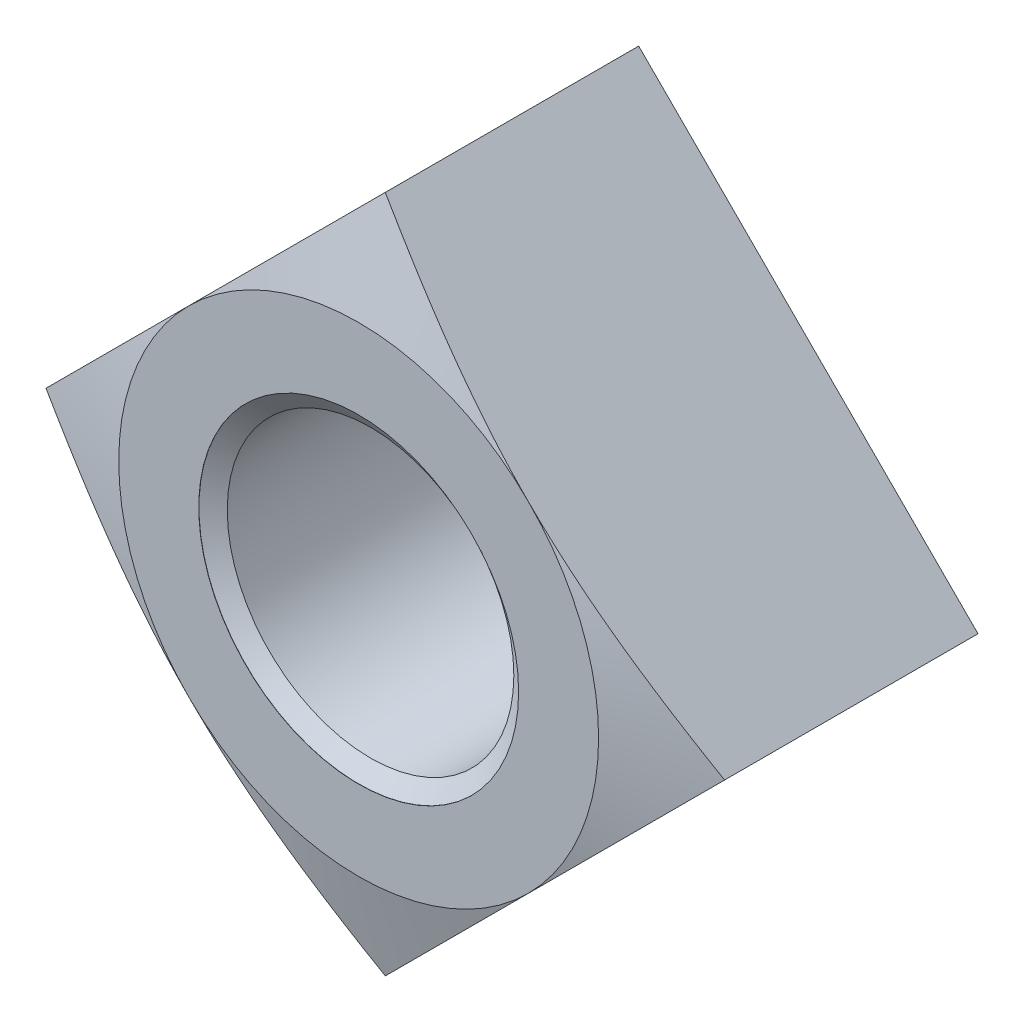
ISO-10303-21;
HEADER;
FILE_DESCRIPTION(('STEP AP214'),'2;1');
FILE_NAME('part.step','',(''),(''),'','','');
FILE_SCHEMA(('AUTOMOTIVE_DESIGN { 1 0 10303 214 1 1 1 1 }'));
ENDSEC;
DATA;
#1=APPLICATION_CONTEXT('core data for automotive mechanical design processes');
#2=APPLICATION_PROTOCOL_DEFINITION('international standard','automotive_design',2000,#1);
#3=PRODUCT_CONTEXT('',#1,'mechanical');
#4=PRODUCT('Part','Part','',(#3));
#5=PRODUCT_RELATED_PRODUCT_CATEGORY('part','',(#4));
#6=PRODUCT_DEFINITION_FORMATION('','',#4);
#7=PRODUCT_DEFINITION_CONTEXT('part definition',#1,'design');
#8=PRODUCT_DEFINITION('design','',#6,#7);
#9=PRODUCT_DEFINITION_SHAPE('','',#8);
#10=(LENGTH_UNIT() NAMED_UNIT(*) SI_UNIT(.MILLI.,.METRE.));
#11=(NAMED_UNIT(*) PLANE_ANGLE_UNIT() SI_UNIT($,.RADIAN.));
#12=(NAMED_UNIT(*) SI_UNIT($,.STERADIAN.) SOLID_ANGLE_UNIT());
#13=UNCERTAINTY_MEASURE_WITH_UNIT(LENGTH_MEASURE(1.E-05),#10,'distance_accuracy_value','');
#14=(GEOMETRIC_REPRESENTATION_CONTEXT(3) GLOBAL_UNCERTAINTY_ASSIGNED_CONTEXT((#13)) GLOBAL_UNIT_ASSIGNED_CONTEXT((#10,
#11,#12)) REPRESENTATION_CONTEXT('',''));
#15=CARTESIAN_POINT('',(0.,0.,0.));
#16=DIRECTION('',(0.,0.,1.));
#17=DIRECTION('',(1.,0.,0.));
#18=AXIS2_PLACEMENT_3D('',#15,#16,#17);
#19=CARTESIAN_POINT('',(40.4111525448112,0.,0.));
#20=DIRECTION('',(0.,0.,1.));
#21=DIRECTION('',(1.,0.,0.));
#22=AXIS2_PLACEMENT_3D('',#19,#20,#21);
#23=PLANE('',#22);
#24=CARTESIAN_POINT('',(0.,0.,0.));
#25=DIRECTION('',(0.,0.,1.));
#26=DIRECTION('',(1.,0.,0.));
#27=AXIS2_PLACEMENT_3D('',#24,#25,#26);
#28=CIRCLE('',#27,19.05);
#29=CARTESIAN_POINT('',(19.05,0.,0.));
#30=VERTEX_POINT('',#29);
#31=EDGE_CURVE('E208',#30,#30,#28,.T.);
#32=ORIENTED_EDGE('',*,*,#31,.F.);
#33=EDGE_LOOP('',(#32));
#34=FACE_BOUND('',#33,.T.);
#35=CARTESIAN_POINT('',(0.,0.,0.));
#36=DIRECTION('',(0.,0.,1.));
#37=DIRECTION('',(1.,0.,0.));
#38=AXIS2_PLACEMENT_3D('',#35,#36,#37);
#39=CIRCLE('',#38,28.575);
#40=CARTESIAN_POINT('',(20.2055762724056,-20.2055762724056,0.));
#41=VERTEX_POINT('',#40);
#42=CARTESIAN_POINT('',(20.2055762724056,20.2055762724056,0.));
#43=VERTEX_POINT('',#42);
#44=EDGE_CURVE('E53',#41,#43,#39,.T.);
#45=ORIENTED_EDGE('',*,*,#44,.T.);
#46=CARTESIAN_POINT('',(-20.2055762724056,20.2055762724056,0.));
#47=VERTEX_POINT('',#46);
#48=EDGE_CURVE('E101',#43,#47,#39,.T.);
#49=ORIENTED_EDGE('',*,*,#48,.T.);
#50=CARTESIAN_POINT('',(-20.2055762724056,-20.2055762724056,0.));
#51=VERTEX_POINT('',#50);
#52=EDGE_CURVE('E90',#47,#51,#39,.T.);
#53=ORIENTED_EDGE('',*,*,#52,.T.);
#54=EDGE_CURVE('E102',#51,#41,#39,.T.);
#55=ORIENTED_EDGE('',*,*,#54,.T.);
#56=EDGE_LOOP('',(#45,#49,#53,#55));
#57=FACE_BOUND('',#56,.T.);
#58=ADVANCED_FACE('F32',(#34,#57),#23,.T.);
#59=CARTESIAN_POINT('',(0.,-40.4111525448112,-33.3502));
#60=DIRECTION('',(0.707106781186548,-0.707106781186547,0.));
#61=DIRECTION('',(0.707106781186547,0.707106781186548,0.));
#62=AXIS2_PLACEMENT_3D('',#59,#60,#61);
#63=PLANE('',#62);
#64=DIRECTION('',(0.,0.,1.));
#65=VECTOR('',#64,1.);
#66=CARTESIAN_POINT('',(40.4111525448112,0.,-33.3502));
#67=LINE('',#66,#65);
#68=CARTESIAN_POINT('',(40.4111525448112,0.,-33.3502));
#69=VERTEX_POINT('',#68);
#70=CARTESIAN_POINT('',(40.4111525448112,0.,-3.17148751587369));
#71=VERTEX_POINT('',#70);
#72=EDGE_CURVE('E127',#69,#71,#67,.T.);
#73=ORIENTED_EDGE('',*,*,#72,.T.);
#74=CARTESIAN_POINT('',(40.4113525448112,0.000199999999990139,-3.17154110584479));
#75=CARTESIAN_POINT('',(39.8049108327059,-0.606241712105331,-3.00907310921222));
#76=CARTESIAN_POINT('',(39.1979948923913,-1.21315765241987,-2.85008038156504));
#77=CARTESIAN_POINT('',(37.9830969400787,-2.42805560473245,-2.54023632423008));
#78=CARTESIAN_POINT('',(37.3751148796716,-3.03603766513954,-2.38938537466495));
#79=CARTESIAN_POINT('',(36.1576234546933,-4.25352909011794,-2.09693498869072));
#80=CARTESIAN_POINT('',(35.5481133486823,-4.86303919612893,-1.95534170129563));
#81=CARTESIAN_POINT('',(34.3278938374312,-6.08325870738002,-1.68292515738994));
#82=CARTESIAN_POINT('',(33.7171844457876,-6.69396809902361,-1.55210177949253));
#83=CARTESIAN_POINT('',(32.4938208685179,-7.91733167629333,-1.302638577703));
#84=CARTESIAN_POINT('',(31.8811652725894,-8.52998727222175,-1.18401252483834));
#85=CARTESIAN_POINT('',(30.6545606640344,-9.75659188077683,-0.960801437423963));
#86=CARTESIAN_POINT('',(30.0406116323939,-10.3705409124173,-0.856216610766811));
#87=CARTESIAN_POINT('',(28.8115781352393,-11.5995744095719,-0.662871488970059));
#88=CARTESIAN_POINT('',(28.1964939044618,-12.2146586403494,-0.574108227416928));
#89=CARTESIAN_POINT('',(26.9651979897377,-13.4459545550735,-0.414126002999316));
#90=CARTESIAN_POINT('',(26.348986343602,-14.0621662012092,-0.342906462245195));
#91=CARTESIAN_POINT('',(25.1249196303647,-15.2862329144465,-0.220530435060478));
#92=CARTESIAN_POINT('',(24.517079007112,-15.8940735376992,-0.169087015718146));
#93=CARTESIAN_POINT('',(23.3007173298575,-17.1104352149537,-0.0859933301985728));
#94=CARTESIAN_POINT('',(22.6921962773717,-17.7189562674395,-0.0543430200092361));
#95=CARTESIAN_POINT('',(21.4747809915278,-18.9363715532834,-0.0116521308581042));
#96=CARTESIAN_POINT('',(20.8658867529548,-19.5452657918564,-0.0006118467922335));
#97=CARTESIAN_POINT('',(19.6480888418748,-20.7630637029364,0.000562277070735697));
#98=CARTESIAN_POINT('',(19.0391851693806,-21.3719673754306,-0.00930385698045055));
#99=CARTESIAN_POINT('',(17.8223388137589,-22.5888137310523,-0.0496574013299574));
#100=CARTESIAN_POINT('',(17.2143957815506,-23.1967567632606,-0.0801239453329884));
#101=CARTESIAN_POINT('',(15.9991691630363,-24.4119833817749,-0.160870006458026));
#102=CARTESIAN_POINT('',(15.3918855812378,-25.0192669635734,-0.21114965816265));
#103=CARTESIAN_POINT('',(14.1782458384852,-26.2329067063261,-0.330309402665974));
#104=CARTESIAN_POINT('',(13.5718896669453,-26.8392628778659,-0.399189281541856));
#105=CARTESIAN_POINT('',(12.3602697900355,-28.0508827547757,-0.554049736934115));
#106=CARTESIAN_POINT('',(11.7550060965402,-28.656146448271,-0.640030498214002));
#107=CARTESIAN_POINT('',(10.684359968988,-29.7267925758232,-0.805948996182882));
#108=CARTESIAN_POINT('',(10.2187321373252,-30.192420407486,-0.882750320419414));
#109=CARTESIAN_POINT('',(9.28824541880411,-31.1229071260071,-1.04475379647959));
#110=CARTESIAN_POINT('',(8.8233864781428,-31.5877660666684,-1.12995533281697));
#111=CARTESIAN_POINT('',(7.42979162874999,-32.9813609160612,-1.39704514025262));
#112=CARTESIAN_POINT('',(6.50214667641665,-33.9090058683946,-1.59040136314882));
#113=CARTESIAN_POINT('',(5.10983637465686,-35.3013161701544,-1.89982246144864));
#114=CARTESIAN_POINT('',(4.64411244355319,-35.767040101258,-2.00656403039739));
#115=CARTESIAN_POINT('',(3.71333417916436,-36.6978183656469,-2.22574783196878));
#116=CARTESIAN_POINT('',(3.24827984460547,-37.1628727002058,-2.33819005373277));
#117=CARTESIAN_POINT('',(2.31897604167655,-38.0921765031347,-2.56814637951577));
#118=CARTESIAN_POINT('',(1.85472634125612,-38.5564262035551,-2.68565861475695));
#119=CARTESIAN_POINT('',(0.926825758606277,-39.484326786205,-2.92527992716862));
#120=CARTESIAN_POINT('',(0.463174869317014,-39.9479776754942,-3.04738894962273));
#121=CARTESIAN_POINT('',(-0.000199999999975971,-40.4113525448112,-3.1715411058448));
#122=B_SPLINE_CURVE_WITH_KNOTS('',3,(#74,#75,#76,#77,#78,#79,#80,#81,#82,#83,#84,#85,#86,#87,
#88,#89,#90,#91,#92,#93,#94,#95,#96,#97,#98,#99,#100,#101,#102,#103,#104,#105,#106,#107,#108,
#109,#110,#111,#112,#113,#114,#115,#116,#117,#118,#119,#120,#121),.UNSPECIFIED.,.F.,.F.,(4,2,2,
2,2,2,2,2,2,2,2,2,2,2,2,2,2,2,2,2,2,2,2,4),(0.,2.61868429864241,5.23749075262517,
7.85801932966209,10.4785183668779,13.1019442433153,15.7254089575724,18.348381275154,
20.9712671805487,23.5545153572028,26.1377577897078,28.7210371839236,31.3043133467324,
33.8849768035376,36.4656577900728,39.0463090972375,41.6269882881152,43.6158142238468,
45.6044945457988,49.5823203342872,51.5839847153093,53.5856452836867,55.5865742514621,
57.5874794093466),.UNSPECIFIED.);
#123=EDGE_CURVE('E123',#71,#41,#122,.T.);
#124=ORIENTED_EDGE('',*,*,#123,.T.);
#125=CARTESIAN_POINT('',(0.,-40.4111525448112,-3.1714875158737));
#126=VERTEX_POINT('',#125);
#127=EDGE_CURVE('E119',#41,#126,#122,.T.);
#128=ORIENTED_EDGE('',*,*,#127,.T.);
#129=DIRECTION('',(0.,0.,1.));
#130=VECTOR('',#129,1.);
#131=CARTESIAN_POINT('',(0.,-40.4111525448112,-33.3502));
#132=LINE('',#131,#130);
#133=CARTESIAN_POINT('',(0.,-40.4111525448112,-33.3502));
#134=VERTEX_POINT('',#133);
#135=EDGE_CURVE('E222',#134,#126,#132,.T.);
#136=ORIENTED_EDGE('',*,*,#135,.F.);
#137=DIRECTION('',(0.707106781186547,0.707106781186548,0.));
#138=VECTOR('',#137,1.);
#139=CARTESIAN_POINT('',(0.,-40.4111525448112,-33.3502));
#140=LINE('',#139,#138);
#141=EDGE_CURVE('E212',#134,#69,#140,.T.);
#142=ORIENTED_EDGE('',*,*,#141,.T.);
#143=EDGE_LOOP('',(#73,#124,#128,#136,#142));
#144=FACE_BOUND('',#143,.T.);
#145=ADVANCED_FACE('F34',(#144),#63,.T.);
#146=CARTESIAN_POINT('',(-40.4111525448112,0.,-33.3502));
#147=DIRECTION('',(-0.707106781186547,-0.707106781186547,0.));
#148=DIRECTION('',(0.707106781186548,-0.707106781186548,0.));
#149=AXIS2_PLACEMENT_3D('',#146,#147,#148);
#150=PLANE('',#149);
#151=ORIENTED_EDGE('',*,*,#135,.T.);
#152=CARTESIAN_POINT('',(0.000200000000022013,-40.4113525448112,-3.1715411058448));
#153=CARTESIAN_POINT('',(-0.606241712105305,-39.8049108327059,-3.00907310921222));
#154=CARTESIAN_POINT('',(-1.21315765241984,-39.1979948923913,-2.85008038156505));
#155=CARTESIAN_POINT('',(-2.42805560473243,-37.9830969400788,-2.54023632423009));
#156=CARTESIAN_POINT('',(-3.03603766513951,-37.3751148796717,-2.38938537466496));
#157=CARTESIAN_POINT('',(-4.25352909011791,-36.1576234546933,-2.09693498869073));
#158=CARTESIAN_POINT('',(-4.8630391961289,-35.5481133486823,-1.95534170129564));
#159=CARTESIAN_POINT('',(-6.08325870737999,-34.3278938374312,-1.68292515738995));
#160=CARTESIAN_POINT('',(-6.69396809902357,-33.7171844457876,-1.55210177949254));
#161=CARTESIAN_POINT('',(-7.9173316762933,-32.4938208685179,-1.30263857770301));
#162=CARTESIAN_POINT('',(-8.52998727222172,-31.8811652725895,-1.18401252483835));
#163=CARTESIAN_POINT('',(-9.7565918807768,-30.6545606640344,-0.960801437423967));
#164=CARTESIAN_POINT('',(-10.3705409124172,-30.040611632394,-0.856216610766815));
#165=CARTESIAN_POINT('',(-11.5995744095719,-28.8115781352393,-0.662871488970062));
#166=CARTESIAN_POINT('',(-12.2146586403494,-28.1964939044618,-0.574108227416929));
#167=CARTESIAN_POINT('',(-13.4459545550734,-26.9651979897378,-0.414126002999316));
#168=CARTESIAN_POINT('',(-14.0621662012091,-26.348986343602,-0.342906462245195));
#169=CARTESIAN_POINT('',(-15.2862329144465,-25.1249196303647,-0.220530435060478));
#170=CARTESIAN_POINT('',(-15.8940735376991,-24.5170790071121,-0.169087015718144));
#171=CARTESIAN_POINT('',(-17.1104352149536,-23.3007173298575,-0.0859933301985705));
#172=CARTESIAN_POINT('',(-17.7189562674395,-22.6921962773717,-0.0543430200092338));
#173=CARTESIAN_POINT('',(-18.9363715532834,-21.4747809915278,-0.0116521308581008));
#174=CARTESIAN_POINT('',(-19.5452657918564,-20.8658867529548,-0.000611846792229103));
#175=CARTESIAN_POINT('',(-20.7630637029364,-19.6480888418748,0.000562277070740596));
#176=CARTESIAN_POINT('',(-21.3719673754306,-19.0391851693806,-0.00930385698044618));
#177=CARTESIAN_POINT('',(-22.5888137310522,-17.8223388137589,-0.0496574013299524));
#178=CARTESIAN_POINT('',(-23.1967567632606,-17.2143957815506,-0.0801239453329823));
#179=CARTESIAN_POINT('',(-24.4119833817749,-15.9991691630363,-0.160870006458019));
#180=CARTESIAN_POINT('',(-25.0192669635734,-15.3918855812378,-0.211149658162644));
#181=CARTESIAN_POINT('',(-26.232906706326,-14.1782458384852,-0.330309402665967));
#182=CARTESIAN_POINT('',(-26.8392628778658,-13.5718896669453,-0.399189281541849));
#183=CARTESIAN_POINT('',(-28.0508827547757,-12.3602697900355,-0.554049736934107));
#184=CARTESIAN_POINT('',(-28.656146448271,-11.7550060965402,-0.640030498213993));
#185=CARTESIAN_POINT('',(-29.7267925758232,-10.684359968988,-0.805948996182873));
#186=CARTESIAN_POINT('',(-30.192420407486,-10.2187321373252,-0.882750320419406));
#187=CARTESIAN_POINT('',(-31.1229071260071,-9.28824541880411,-1.04475379647959));
#188=CARTESIAN_POINT('',(-31.5877660666684,-8.8233864781428,-1.12995533281696));
#189=CARTESIAN_POINT('',(-32.9813609160612,-7.42979162874998,-1.39704514025261));
#190=CARTESIAN_POINT('',(-33.9090058683946,-6.50214667641664,-1.59040136314882));
#191=CARTESIAN_POINT('',(-35.3013161701543,-5.10983637465685,-1.89982246144864));
#192=CARTESIAN_POINT('',(-35.767040101258,-4.64411244355318,-2.00656403039738));
#193=CARTESIAN_POINT('',(-36.6978183656468,-3.71333417916434,-2.22574783196877));
#194=CARTESIAN_POINT('',(-37.1628727002057,-3.24827984460546,-2.33819005373276));
#195=CARTESIAN_POINT('',(-38.0921765031347,-2.31897604167653,-2.56814637951576));
#196=CARTESIAN_POINT('',(-38.5564262035551,-1.8547263412561,-2.68565861475694));
#197=CARTESIAN_POINT('',(-39.4843267862049,-0.92682575860626,-2.92527992716862));
#198=CARTESIAN_POINT('',(-39.9479776754942,-0.463174869316998,-3.04738894962273));
#199=CARTESIAN_POINT('',(-40.4113525448112,0.000199999999993278,-3.17154110584479));
#200=B_SPLINE_CURVE_WITH_KNOTS('',3,(#152,#153,#154,#155,#156,#157,#158,#159,#160,#161,#162,
#163,#164,#165,#166,#167,#168,#169,#170,#171,#172,#173,#174,#175,#176,#177,#178,#179,#180,#181,
#182,#183,#184,#185,#186,#187,#188,#189,#190,#191,#192,#193,#194,#195,#196,#197,#198,#199),
.UNSPECIFIED.,.F.,.F.,(4,2,2,2,2,2,2,2,2,2,2,2,2,2,2,2,2,2,2,2,2,2,2,4),(0.,2.61868429864241,
5.23749075262516,7.85801932966209,10.4785183668779,13.1019442433153,15.7254089575724,
18.348381275154,20.9712671805487,23.5545153572028,26.1377577897078,28.7210371839237,
31.3043133467324,33.8849768035376,36.4656577900729,39.0463090972375,41.6269882881152,
43.6158142238468,45.6044945457989,49.5823203342872,51.5839847153094,53.5856452836868,
55.5865742514622,57.5874794093467),.UNSPECIFIED.);
#201=EDGE_CURVE('E117',#126,#51,#200,.T.);
#202=ORIENTED_EDGE('',*,*,#201,.T.);
#203=CARTESIAN_POINT('',(-40.4111525448112,0.,-3.17148751587369));
#204=VERTEX_POINT('',#203);
#205=EDGE_CURVE('E96',#51,#204,#200,.T.);
#206=ORIENTED_EDGE('',*,*,#205,.T.);
#207=DIRECTION('',(0.,0.,1.));
#208=VECTOR('',#207,1.);
#209=CARTESIAN_POINT('',(-40.4111525448112,0.,-33.3502));
#210=LINE('',#209,#208);
#211=CARTESIAN_POINT('',(-40.4111525448112,0.,-33.3502));
#212=VERTEX_POINT('',#211);
#213=EDGE_CURVE('E114',#212,#204,#210,.T.);
#214=ORIENTED_EDGE('',*,*,#213,.F.);
#215=DIRECTION('',(0.707106781186548,-0.707106781186548,0.));
#216=VECTOR('',#215,1.);
#217=CARTESIAN_POINT('',(-40.4111525448112,0.,-33.3502));
#218=LINE('',#217,#216);
#219=EDGE_CURVE('E219',#212,#134,#218,.T.);
#220=ORIENTED_EDGE('',*,*,#219,.T.);
#221=EDGE_LOOP('',(#151,#202,#206,#214,#220));
#222=FACE_BOUND('',#221,.T.);
#223=ADVANCED_FACE('F160',(#222),#150,.T.);
#224=CARTESIAN_POINT('',(0.,40.4111525448112,-33.3502));
#225=DIRECTION('',(-0.707106781186548,0.707106781186547,0.));
#226=DIRECTION('',(-0.707106781186547,-0.707106781186548,0.));
#227=AXIS2_PLACEMENT_3D('',#224,#225,#226);
#228=PLANE('',#227);
#229=ORIENTED_EDGE('',*,*,#213,.T.);
#230=CARTESIAN_POINT('',(-40.4113525448112,-0.000200000000015292,-3.17154110584479));
#231=CARTESIAN_POINT('',(-39.8049108327059,0.606241712105312,-3.00907310921222));
#232=CARTESIAN_POINT('',(-39.1979948923913,1.21315765241985,-2.85008038156504));
#233=CARTESIAN_POINT('',(-37.9830969400787,2.42805560473243,-2.54023632423008));
#234=CARTESIAN_POINT('',(-37.3751148796716,3.03603766513952,-2.38938537466495));
#235=CARTESIAN_POINT('',(-36.1576234546933,4.25352909011791,-2.09693498869072));
#236=CARTESIAN_POINT('',(-35.5481133486823,4.8630391961289,-1.95534170129563));
#237=CARTESIAN_POINT('',(-34.3278938374312,6.08325870737999,-1.68292515738995));
#238=CARTESIAN_POINT('',(-33.7171844457876,6.69396809902358,-1.55210177949253));
#239=CARTESIAN_POINT('',(-32.4938208685179,7.9173316762933,-1.30263857770301));
#240=CARTESIAN_POINT('',(-31.8811652725895,8.52998727222172,-1.18401252483834));
#241=CARTESIAN_POINT('',(-30.6545606640344,9.7565918807768,-0.960801437423963));
#242=CARTESIAN_POINT('',(-30.0406116323939,10.3705409124172,-0.85621661076681));
#243=CARTESIAN_POINT('',(-28.8115781352393,11.5995744095719,-0.662871488970056));
#244=CARTESIAN_POINT('',(-28.1964939044618,12.2146586403494,-0.574108227416925));
#245=CARTESIAN_POINT('',(-26.9651979897377,13.4459545550734,-0.414126002999312));
#246=CARTESIAN_POINT('',(-26.348986343602,14.0621662012091,-0.342906462245192));
#247=CARTESIAN_POINT('',(-25.1249196303647,15.2862329144465,-0.220530435060474));
#248=CARTESIAN_POINT('',(-24.517079007112,15.8940735376991,-0.16908701571814));
#249=CARTESIAN_POINT('',(-23.3007173298575,17.1104352149536,-0.085993330198567));
#250=CARTESIAN_POINT('',(-22.6921962773717,17.7189562674395,-0.0543430200092307));
#251=CARTESIAN_POINT('',(-21.4747809915278,18.9363715532834,-0.0116521308580992));
#252=CARTESIAN_POINT('',(-20.8658867529548,19.5452657918564,-0.000611846792228489));
#253=CARTESIAN_POINT('',(-19.6480888418748,20.7630637029364,0.000562277070740912));
#254=CARTESIAN_POINT('',(-19.0391851693806,21.3719673754306,-0.00930385698044518));
#255=CARTESIAN_POINT('',(-17.8223388137589,22.5888137310522,-0.0496574013299515));
#256=CARTESIAN_POINT('',(-17.2143957815506,23.1967567632606,-0.0801239453329823));
#257=CARTESIAN_POINT('',(-15.9991691630363,24.4119833817749,-0.160870006458019));
#258=CARTESIAN_POINT('',(-15.3918855812378,25.0192669635734,-0.211149658162643));
#259=CARTESIAN_POINT('',(-14.1782458384852,26.232906706326,-0.330309402665966));
#260=CARTESIAN_POINT('',(-13.5718896669454,26.8392628778658,-0.399189281541849));
#261=CARTESIAN_POINT('',(-12.3602697900355,28.0508827547757,-0.554049736934107));
#262=CARTESIAN_POINT('',(-11.7550060965402,28.656146448271,-0.640030498213992));
#263=CARTESIAN_POINT('',(-10.684359968988,29.7267925758232,-0.805948996182873));
#264=CARTESIAN_POINT('',(-10.2187321373252,30.192420407486,-0.882750320419406));
#265=CARTESIAN_POINT('',(-9.28824541880411,31.1229071260071,-1.04475379647959));
#266=CARTESIAN_POINT('',(-8.8233864781428,31.5877660666684,-1.12995533281696));
#267=CARTESIAN_POINT('',(-7.42979162874999,32.9813609160612,-1.39704514025261));
#268=CARTESIAN_POINT('',(-6.50214667641664,33.9090058683946,-1.59040136314882));
#269=CARTESIAN_POINT('',(-5.10983637465685,35.3013161701543,-1.89982246144864));
#270=CARTESIAN_POINT('',(-4.64411244355318,35.767040101258,-2.00656403039738));
#271=CARTESIAN_POINT('',(-3.71333417916435,36.6978183656468,-2.22574783196877));
#272=CARTESIAN_POINT('',(-3.24827984460546,37.1628727002057,-2.33819005373276));
#273=CARTESIAN_POINT('',(-2.31897604167654,38.0921765031347,-2.56814637951577));
#274=CARTESIAN_POINT('',(-1.8547263412561,38.5564262035551,-2.68565861475695));
#275=CARTESIAN_POINT('',(-0.926825758606263,39.4843267862049,-2.92527992716862));
#276=CARTESIAN_POINT('',(-0.463174869317003,39.9479776754942,-3.04738894962273));
#277=CARTESIAN_POINT('',(0.000199999999989222,40.4113525448112,-3.17154110584479));
#278=B_SPLINE_CURVE_WITH_KNOTS('',3,(#230,#231,#232,#233,#234,#235,#236,#237,#238,#239,#240,
#241,#242,#243,#244,#245,#246,#247,#248,#249,#250,#251,#252,#253,#254,#255,#256,#257,#258,#259,
#260,#261,#262,#263,#264,#265,#266,#267,#268,#269,#270,#271,#272,#273,#274,#275,#276,#277),
.UNSPECIFIED.,.F.,.F.,(4,2,2,2,2,2,2,2,2,2,2,2,2,2,2,2,2,2,2,2,2,2,2,4),(0.,2.61868429864241,
5.23749075262516,7.85801932966209,10.4785183668779,13.1019442433153,15.7254089575723,
18.348381275154,20.9712671805487,23.5545153572028,26.1377577897078,28.7210371839236,
31.3043133467324,33.8849768035376,36.4656577900728,39.0463090972375,41.6269882881152,
43.6158142238468,45.6044945457988,49.5823203342872,51.5839847153093,53.5856452836867,
55.5865742514622,57.5874794093467),.UNSPECIFIED.);
#279=EDGE_CURVE('E94',#204,#47,#278,.T.);
#280=ORIENTED_EDGE('',*,*,#279,.T.);
#281=CARTESIAN_POINT('',(0.,40.4111525448112,-3.1714875158737));
#282=VERTEX_POINT('',#281);
#283=EDGE_CURVE('E107',#47,#282,#278,.T.);
#284=ORIENTED_EDGE('',*,*,#283,.T.);
#285=DIRECTION('',(0.,0.,1.));
#286=VECTOR('',#285,1.);
#287=CARTESIAN_POINT('',(0.,40.4111525448112,-33.3502));
#288=LINE('',#287,#286);
#289=CARTESIAN_POINT('',(0.,40.4111525448112,-33.3502));
#290=VERTEX_POINT('',#289);
#291=EDGE_CURVE('E225',#290,#282,#288,.T.);
#292=ORIENTED_EDGE('',*,*,#291,.F.);
#293=DIRECTION('',(-0.707106781186547,-0.707106781186548,0.));
#294=VECTOR('',#293,1.);
#295=CARTESIAN_POINT('',(0.,40.4111525448112,-33.3502));
#296=LINE('',#295,#294);
#297=EDGE_CURVE('E217',#290,#212,#296,.T.);
#298=ORIENTED_EDGE('',*,*,#297,.T.);
#299=EDGE_LOOP('',(#229,#280,#284,#292,#298));
#300=FACE_BOUND('',#299,.T.);
#301=ADVANCED_FACE('F112',(#300),#228,.T.);
#302=CARTESIAN_POINT('',(40.4111525448112,0.,-33.3502));
#303=DIRECTION('',(0.707106781186548,0.707106781186548,0.));
#304=DIRECTION('',(-0.707106781186548,0.707106781186548,0.));
#305=AXIS2_PLACEMENT_3D('',#302,#303,#304);
#306=PLANE('',#305);
#307=ORIENTED_EDGE('',*,*,#291,.T.);
#308=CARTESIAN_POINT('',(-0.000200000000011087,40.4113525448112,-3.17154110584479));
#309=CARTESIAN_POINT('',(0.606241712105315,39.8049108327059,-3.00907310921222));
#310=CARTESIAN_POINT('',(1.21315765241985,39.1979948923913,-2.85008038156504));
#311=CARTESIAN_POINT('',(2.42805560473243,37.9830969400787,-2.54023632423008));
#312=CARTESIAN_POINT('',(3.03603766513952,37.3751148796716,-2.38938537466495));
#313=CARTESIAN_POINT('',(4.25352909011791,36.1576234546933,-2.09693498869072));
#314=CARTESIAN_POINT('',(4.86303919612891,35.5481133486823,-1.95534170129563));
#315=CARTESIAN_POINT('',(6.08325870738,34.3278938374312,-1.68292515738995));
#316=CARTESIAN_POINT('',(6.69396809902358,33.7171844457876,-1.55210177949253));
#317=CARTESIAN_POINT('',(7.91733167629331,32.4938208685179,-1.302638577703));
#318=CARTESIAN_POINT('',(8.52998727222173,31.8811652725894,-1.18401252483834));
#319=CARTESIAN_POINT('',(9.7565918807768,30.6545606640344,-0.960801437423962));
#320=CARTESIAN_POINT('',(10.3705409124172,30.0406116323939,-0.85621661076681));
#321=CARTESIAN_POINT('',(11.5995744095719,28.8115781352393,-0.662871488970058));
#322=CARTESIAN_POINT('',(12.2146586403494,28.1964939044618,-0.574108227416926));
#323=CARTESIAN_POINT('',(13.4459545550734,26.9651979897377,-0.414126002999313));
#324=CARTESIAN_POINT('',(14.0621662012091,26.348986343602,-0.342906462245191));
#325=CARTESIAN_POINT('',(15.2862329144465,25.1249196303647,-0.220530435060474));
#326=CARTESIAN_POINT('',(15.8940735376991,24.517079007112,-0.169087015718142));
#327=CARTESIAN_POINT('',(17.1104352149536,23.3007173298575,-0.0859933301985689));
#328=CARTESIAN_POINT('',(17.7189562674395,22.6921962773717,-0.0543430200092314));
#329=CARTESIAN_POINT('',(18.9363715532834,21.4747809915278,-0.0116521308580985));
#330=CARTESIAN_POINT('',(19.5452657918564,20.8658867529548,-0.000611846792227617));
#331=CARTESIAN_POINT('',(20.7630637029364,19.6480888418748,0.000562277070741899));
#332=CARTESIAN_POINT('',(21.3719673754306,19.0391851693806,-0.00930385698044424));
#333=CARTESIAN_POINT('',(22.5888137310522,17.8223388137589,-0.0496574013299507));
#334=CARTESIAN_POINT('',(23.1967567632606,17.2143957815506,-0.0801239453329814));
#335=CARTESIAN_POINT('',(24.4119833817749,15.9991691630363,-0.160870006458018));
#336=CARTESIAN_POINT('',(25.0192669635733,15.3918855812378,-0.211149658162642));
#337=CARTESIAN_POINT('',(26.232906706326,14.1782458384852,-0.330309402665964));
#338=CARTESIAN_POINT('',(26.8392628778658,13.5718896669453,-0.399189281541846));
#339=CARTESIAN_POINT('',(28.0508827547757,12.3602697900355,-0.554049736934104));
#340=CARTESIAN_POINT('',(28.656146448271,11.7550060965402,-0.64003049821399));
#341=CARTESIAN_POINT('',(29.7267925758232,10.684359968988,-0.805948996182871));
#342=CARTESIAN_POINT('',(30.192420407486,10.2187321373252,-0.882750320419404));
#343=CARTESIAN_POINT('',(31.1229071260071,9.2882454188041,-1.04475379647958));
#344=CARTESIAN_POINT('',(31.5877660666684,8.82338647814279,-1.12995533281696));
#345=CARTESIAN_POINT('',(32.9813609160612,7.42979162874997,-1.39704514025261));
#346=CARTESIAN_POINT('',(33.9090058683946,6.50214667641663,-1.59040136314882));
#347=CARTESIAN_POINT('',(35.3013161701543,5.10983637465684,-1.89982246144864));
#348=CARTESIAN_POINT('',(35.767040101258,4.64411244355317,-2.00656403039738));
#349=CARTESIAN_POINT('',(36.6978183656468,3.71333417916433,-2.22574783196877));
#350=CARTESIAN_POINT('',(37.1628727002057,3.24827984460545,-2.33819005373276));
#351=CARTESIAN_POINT('',(38.0921765031347,2.31897604167653,-2.56814637951576));
#352=CARTESIAN_POINT('',(38.5564262035551,1.85472634125609,-2.68565861475694));
#353=CARTESIAN_POINT('',(39.4843267862049,0.926825758606253,-2.92527992716862));
#354=CARTESIAN_POINT('',(39.9479776754942,0.46317486931699,-3.04738894962273));
#355=CARTESIAN_POINT('',(40.4113525448112,-0.000200000000002302,-3.17154110584479));
#356=B_SPLINE_CURVE_WITH_KNOTS('',3,(#308,#309,#310,#311,#312,#313,#314,#315,#316,#317,#318,
#319,#320,#321,#322,#323,#324,#325,#326,#327,#328,#329,#330,#331,#332,#333,#334,#335,#336,#337,
#338,#339,#340,#341,#342,#343,#344,#345,#346,#347,#348,#349,#350,#351,#352,#353,#354,#355),
.UNSPECIFIED.,.F.,.F.,(4,2,2,2,2,2,2,2,2,2,2,2,2,2,2,2,2,2,2,2,2,2,2,4),(0.,2.61868429864242,
5.23749075262516,7.85801932966209,10.4785183668779,13.1019442433153,15.7254089575724,
18.348381275154,20.9712671805487,23.5545153572028,26.1377577897078,28.7210371839236,
31.3043133467324,33.8849768035376,36.4656577900728,39.0463090972375,41.6269882881152,
43.6158142238468,45.6044945457988,49.5823203342872,51.5839847153094,53.5856452836867,
55.5865742514622,57.5874794093467),.UNSPECIFIED.);
#357=EDGE_CURVE('E11',#282,#43,#356,.T.);
#358=ORIENTED_EDGE('',*,*,#357,.T.);
#359=EDGE_CURVE('E37',#43,#71,#356,.T.);
#360=ORIENTED_EDGE('',*,*,#359,.T.);
#361=ORIENTED_EDGE('',*,*,#72,.F.);
#362=DIRECTION('',(-0.707106781186547,0.707106781186547,0.));
#363=VECTOR('',#362,1.);
#364=CARTESIAN_POINT('',(40.4111525448112,0.,-33.3502));
#365=LINE('',#364,#363);
#366=EDGE_CURVE('E214',#69,#290,#365,.T.);
#367=ORIENTED_EDGE('',*,*,#366,.T.);
#368=EDGE_LOOP('',(#307,#358,#360,#361,#367));
#369=FACE_BOUND('',#368,.T.);
#370=ADVANCED_FACE('F159',(#369),#306,.T.);
#371=CARTESIAN_POINT('',(0.,0.,-33.3502));
#372=DIRECTION('',(0.,0.,1.));
#373=DIRECTION('',(1.,0.,0.));
#374=AXIS2_PLACEMENT_3D('',#371,#372,#373);
#375=CYLINDRICAL_SURFACE('',#374,17.06626);
#376=CARTESIAN_POINT('',(0.,0.,-1.41391378464199));
#377=DIRECTION('',(0.,0.,1.));
#378=DIRECTION('',(1.,0.,0.));
#379=AXIS2_PLACEMENT_3D('',#376,#377,#378);
#380=CIRCLE('',#379,17.06626);
#381=CARTESIAN_POINT('',(17.06626,0.,-1.41391378464199));
#382=VERTEX_POINT('',#381);
#383=EDGE_CURVE('E211',#382,#382,#380,.F.);
#384=ORIENTED_EDGE('',*,*,#383,.F.);
#385=EDGE_LOOP('',(#384));
#386=FACE_BOUND('',#385,.T.);
#387=CARTESIAN_POINT('',(0.,0.,-31.936286215358));
#388=DIRECTION('',(0.,0.,-1.));
#389=DIRECTION('',(-1.,0.,0.));
#390=AXIS2_PLACEMENT_3D('',#387,#388,#389);
#391=CIRCLE('',#390,17.06626);
#392=CARTESIAN_POINT('',(-17.06626,0.,-31.936286215358));
#393=VERTEX_POINT('',#392);
#394=EDGE_CURVE('E202',#393,#393,#391,.F.);
#395=ORIENTED_EDGE('',*,*,#394,.F.);
#396=EDGE_LOOP('',(#395));
#397=FACE_BOUND('',#396,.T.);
#398=ADVANCED_FACE('F165',(#386,#397),#375,.F.);
#399=CARTESIAN_POINT('',(40.4111525448112,0.,-33.3502));
#400=DIRECTION('',(0.,0.,1.));
#401=DIRECTION('',(1.,0.,0.));
#402=AXIS2_PLACEMENT_3D('',#399,#400,#401);
#403=PLANE('',#402);
#404=ORIENTED_EDGE('',*,*,#141,.F.);
#405=ORIENTED_EDGE('',*,*,#219,.F.);
#406=ORIENTED_EDGE('',*,*,#297,.F.);
#407=ORIENTED_EDGE('',*,*,#366,.F.);
#408=EDGE_LOOP('',(#404,#405,#406,#407));
#409=FACE_BOUND('',#408,.T.);
#410=CARTESIAN_POINT('',(0.,0.,-33.3502));
#411=DIRECTION('',(0.,0.,1.));
#412=DIRECTION('',(1.,0.,0.));
#413=AXIS2_PLACEMENT_3D('',#410,#411,#412);
#414=CIRCLE('',#413,19.05);
#415=CARTESIAN_POINT('',(19.05,0.,-33.3502));
#416=VERTEX_POINT('',#415);
#417=EDGE_CURVE('E130',#416,#416,#414,.T.);
#418=ORIENTED_EDGE('',*,*,#417,.T.);
#419=EDGE_LOOP('',(#418));
#420=FACE_BOUND('',#419,.T.);
#421=ADVANCED_FACE('F169',(#409,#420),#403,.F.);
#422=CARTESIAN_POINT('',(0.,0.,-1.5527651631062));
#423=DIRECTION('',(0.,0.,1.));
#424=DIRECTION('',(1.,0.,0.));
#425=AXIS2_PLACEMENT_3D('',#422,#423,#424);
#426=CONICAL_SURFACE('',#425,16.867886,0.960105621522087);
#427=CARTESIAN_POINT('',(0.,0.,-0.0254000000000087));
#428=DIRECTION('',(0.,0.,1.));
#429=DIRECTION('',(1.,0.,0.));
#430=AXIS2_PLACEMENT_3D('',#427,#428,#429);
#431=CIRCLE('',#430,19.05);
#432=CARTESIAN_POINT('',(19.05,0.,-0.0254000000000087));
#433=VERTEX_POINT('',#432);
#434=EDGE_CURVE('E204',#433,#433,#431,.T.);
#435=ORIENTED_EDGE('',*,*,#434,.T.);
#436=EDGE_LOOP('',(#435));
#437=FACE_BOUND('',#436,.T.);
#438=ORIENTED_EDGE('',*,*,#383,.T.);
#439=EDGE_LOOP('',(#438));
#440=FACE_BOUND('',#439,.T.);
#441=ADVANCED_FACE('F180',(#437,#440),#426,.F.);
#442=CARTESIAN_POINT('',(0.,0.,-25.0375057290932));
#443=DIRECTION('',(0.,0.,1.));
#444=DIRECTION('',(1.,0.,0.));
#445=AXIS2_PLACEMENT_3D('',#442,#443,#444);
#446=CYLINDRICAL_SURFACE('',#445,19.05);
#447=ORIENTED_EDGE('',*,*,#31,.T.);
#448=EDGE_LOOP('',(#447));
#449=FACE_BOUND('',#448,.T.);
#450=ORIENTED_EDGE('',*,*,#434,.F.);
#451=EDGE_LOOP('',(#450));
#452=FACE_BOUND('',#451,.T.);
#453=ADVANCED_FACE('F183',(#449,#452),#446,.F.);
#454=CARTESIAN_POINT('',(0.,0.,-33.3248));
#455=DIRECTION('',(0.,0.,-1.));
#456=DIRECTION('',(-1.,0.,0.));
#457=AXIS2_PLACEMENT_3D('',#454,#455,#456);
#458=CONICAL_SURFACE('',#457,19.05,0.96010562152208);
#459=CARTESIAN_POINT('',(0.,0.,-33.3248));
#460=DIRECTION('',(0.,0.,1.));
#461=DIRECTION('',(1.,0.,0.));
#462=AXIS2_PLACEMENT_3D('',#459,#460,#461);
#463=CIRCLE('',#462,19.05);
#464=CARTESIAN_POINT('',(19.05,0.,-33.3248));
#465=VERTEX_POINT('',#464);
#466=EDGE_CURVE('E128',#465,#465,#463,.T.);
#467=ORIENTED_EDGE('',*,*,#466,.F.);
#468=EDGE_LOOP('',(#467));
#469=FACE_BOUND('',#468,.T.);
#470=ORIENTED_EDGE('',*,*,#394,.T.);
#471=EDGE_LOOP('',(#470));
#472=FACE_BOUND('',#471,.T.);
#473=ADVANCED_FACE('F147',(#469,#472),#458,.F.);
#474=CARTESIAN_POINT('',(0.,0.,-25.0375057290932));
#475=DIRECTION('',(0.,0.,1.));
#476=DIRECTION('',(1.,0.,0.));
#477=AXIS2_PLACEMENT_3D('',#474,#475,#476);
#478=CYLINDRICAL_SURFACE('',#477,19.05);
#479=ORIENTED_EDGE('',*,*,#466,.T.);
#480=EDGE_LOOP('',(#479));
#481=FACE_BOUND('',#480,.T.);
#482=ORIENTED_EDGE('',*,*,#417,.F.);
#483=EDGE_LOOP('',(#482));
#484=FACE_BOUND('',#483,.T.);
#485=ADVANCED_FACE('F189',(#481,#484),#478,.F.);
#486=CARTESIAN_POINT('',(0.,0.,0.));
#487=DIRECTION('',(0.,0.,-1.));
#488=DIRECTION('',(-1.,0.,0.));
#489=AXIS2_PLACEMENT_3D('',#486,#487,#488);
#490=CONICAL_SURFACE('',#489,28.575,1.30899693899575);
#491=ORIENTED_EDGE('',*,*,#359,.F.);
#492=ORIENTED_EDGE('',*,*,#44,.F.);
#493=ORIENTED_EDGE('',*,*,#123,.F.);
#494=EDGE_LOOP('',(#491,#492,#493));
#495=FACE_BOUND('',#494,.T.);
#496=ADVANCED_FACE('F146',(#495),#490,.T.);
#497=ORIENTED_EDGE('',*,*,#48,.F.);
#498=ORIENTED_EDGE('',*,*,#357,.F.);
#499=ORIENTED_EDGE('',*,*,#283,.F.);
#500=EDGE_LOOP('',(#497,#498,#499));
#501=FACE_BOUND('',#500,.T.);
#502=ADVANCED_FACE('F108',(#501),#490,.T.);
#503=ORIENTED_EDGE('',*,*,#52,.F.);
#504=ORIENTED_EDGE('',*,*,#279,.F.);
#505=ORIENTED_EDGE('',*,*,#205,.F.);
#506=EDGE_LOOP('',(#503,#504,#505));
#507=FACE_BOUND('',#506,.T.);
#508=ADVANCED_FACE('F92',(#507),#490,.T.);
#509=ORIENTED_EDGE('',*,*,#54,.F.);
#510=ORIENTED_EDGE('',*,*,#201,.F.);
#511=ORIENTED_EDGE('',*,*,#127,.F.);
#512=EDGE_LOOP('',(#509,#510,#511));
#513=FACE_BOUND('',#512,.T.);
#514=ADVANCED_FACE('F116',(#513),#490,.T.);
#515=CLOSED_SHELL('',(#58,#145,#223,#301,#370,#398,#421,#441,#453,#473,#485,#496,#502,#508,#514));
#516=MANIFOLD_SOLID_BREP('B2',#515);
#517=ADVANCED_BREP_SHAPE_REPRESENTATION('',(#18,#516),#14);
#518=SHAPE_DEFINITION_REPRESENTATION(#9,#517);
ENDSEC;
END-ISO-10303-21;
